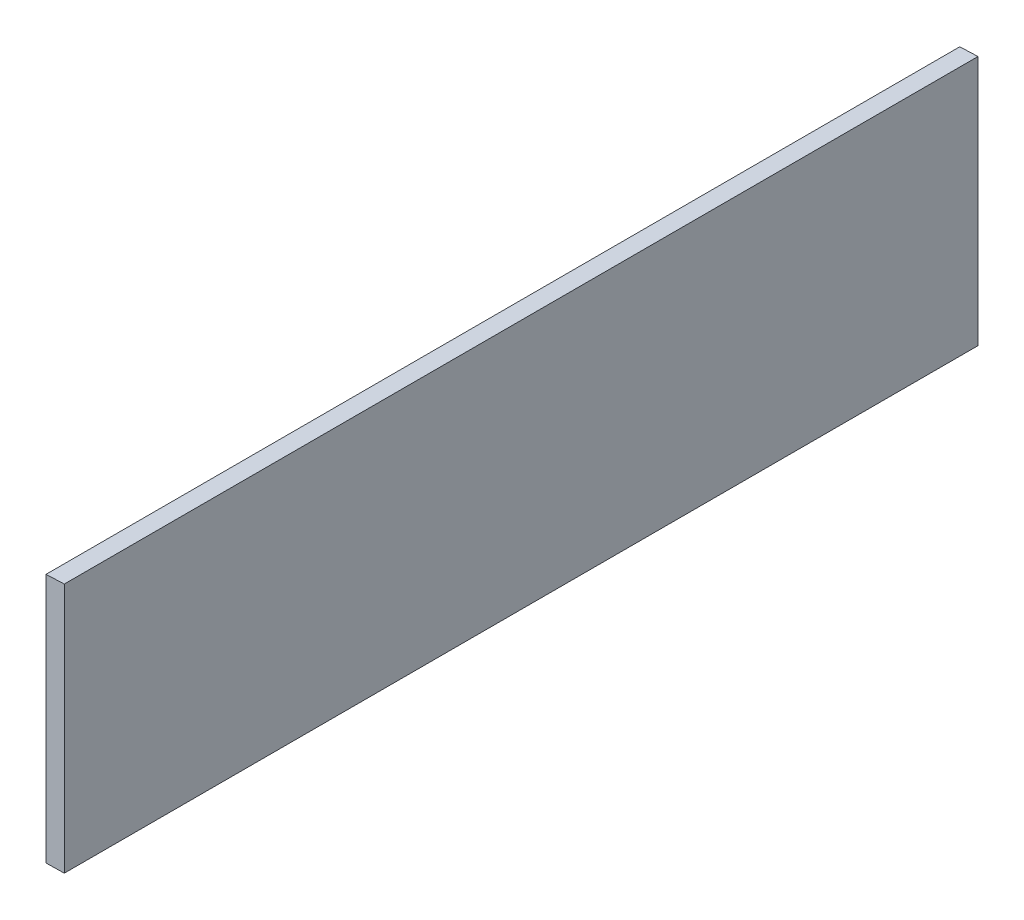
ISO-10303-21;
HEADER;
FILE_DESCRIPTION(('STEP AP214'),'2;1');
FILE_NAME('part.step','',(''),(''),'','','');
FILE_SCHEMA(('AUTOMOTIVE_DESIGN { 1 0 10303 214 1 1 1 1 }'));
ENDSEC;
DATA;
#1=APPLICATION_CONTEXT('core data for automotive mechanical design processes');
#2=APPLICATION_PROTOCOL_DEFINITION('international standard','automotive_design',2000,#1);
#3=PRODUCT_CONTEXT('',#1,'mechanical');
#4=PRODUCT('Part','Part','',(#3));
#5=PRODUCT_RELATED_PRODUCT_CATEGORY('part','',(#4));
#6=PRODUCT_DEFINITION_FORMATION('','',#4);
#7=PRODUCT_DEFINITION_CONTEXT('part definition',#1,'design');
#8=PRODUCT_DEFINITION('design','',#6,#7);
#9=PRODUCT_DEFINITION_SHAPE('','',#8);
#10=(LENGTH_UNIT() NAMED_UNIT(*) SI_UNIT(.MILLI.,.METRE.));
#11=(NAMED_UNIT(*) PLANE_ANGLE_UNIT() SI_UNIT($,.RADIAN.));
#12=(NAMED_UNIT(*) SI_UNIT($,.STERADIAN.) SOLID_ANGLE_UNIT());
#13=UNCERTAINTY_MEASURE_WITH_UNIT(LENGTH_MEASURE(1.E-05),#10,'distance_accuracy_value','');
#14=(GEOMETRIC_REPRESENTATION_CONTEXT(3) GLOBAL_UNCERTAINTY_ASSIGNED_CONTEXT((#13)) GLOBAL_UNIT_ASSIGNED_CONTEXT((#10,
#11,#12)) REPRESENTATION_CONTEXT('',''));
#15=CARTESIAN_POINT('',(0.,0.,0.));
#16=DIRECTION('',(0.,0.,1.));
#17=DIRECTION('',(1.,0.,0.));
#18=AXIS2_PLACEMENT_3D('',#15,#16,#17);
#19=CARTESIAN_POINT('',(78.232,0.,101.6));
#20=DIRECTION('',(1.,0.,0.));
#21=DIRECTION('',(0.,0.,-1.));
#22=AXIS2_PLACEMENT_3D('',#19,#20,#21);
#23=PLANE('',#22);
#24=DIRECTION('',(0.,-1.,0.));
#25=VECTOR('',#24,1.);
#26=CARTESIAN_POINT('',(78.232,0.,0.));
#27=LINE('',#26,#25);
#28=CARTESIAN_POINT('',(78.232,20.9057937484348,0.));
#29=VERTEX_POINT('',#28);
#30=CARTESIAN_POINT('',(78.232,-6.94151566862169,0.));
#31=VERTEX_POINT('',#30);
#32=EDGE_CURVE('E111',#29,#31,#27,.T.);
#33=ORIENTED_EDGE('',*,*,#32,.F.);
#34=DIRECTION('',(0.,0.,-1.));
#35=VECTOR('',#34,1.);
#36=CARTESIAN_POINT('',(78.232,20.9057937484348,101.6));
#37=LINE('',#36,#35);
#38=CARTESIAN_POINT('',(78.232,20.9057937484348,101.6));
#39=VERTEX_POINT('',#38);
#40=EDGE_CURVE('E11',#39,#29,#37,.T.);
#41=ORIENTED_EDGE('',*,*,#40,.F.);
#42=DIRECTION('',(0.,-1.,0.));
#43=VECTOR('',#42,1.);
#44=CARTESIAN_POINT('',(78.232,0.,101.6));
#45=LINE('',#44,#43);
#46=CARTESIAN_POINT('',(78.232,-6.94151566862169,101.6));
#47=VERTEX_POINT('',#46);
#48=EDGE_CURVE('E97',#39,#47,#45,.T.);
#49=ORIENTED_EDGE('',*,*,#48,.T.);
#50=DIRECTION('',(0.,0.,-1.));
#51=VECTOR('',#50,1.);
#52=CARTESIAN_POINT('',(78.232,-6.94151566862169,101.6));
#53=LINE('',#52,#51);
#54=EDGE_CURVE('E86',#47,#31,#53,.T.);
#55=ORIENTED_EDGE('',*,*,#54,.T.);
#56=EDGE_LOOP('',(#33,#41,#49,#55));
#57=FACE_BOUND('',#56,.T.);
#58=ADVANCED_FACE('F47',(#57),#23,.T.);
#59=CARTESIAN_POINT('',(304.8,0.,101.6));
#60=CARTESIAN_POINT('',(304.801618834867,0.0105404782342497,101.6));
#61=CARTESIAN_POINT('',(302.668974732205,0.220720306657686,101.6));
#62=CARTESIAN_POINT('',(300.521978172348,0.544561192924455,101.6));
#63=CARTESIAN_POINT('',(295.368886494755,1.2875328814366,101.6));
#64=CARTESIAN_POINT('',(289.160913878016,2.33645198943612,101.6));
#65=CARTESIAN_POINT('',(281.213840868588,3.71952821524651,101.6));
#66=CARTESIAN_POINT('',(272.021147758702,5.34248875191025,101.6));
#67=CARTESIAN_POINT('',(261.61106980903,7.12581444026362,101.6));
#68=CARTESIAN_POINT('',(250.148168886435,8.97226886192319,101.6));
#69=CARTESIAN_POINT('',(237.729227104966,10.7955186206566,101.6));
#70=CARTESIAN_POINT('',(224.4666688294,12.5459449601576,101.6));
#71=CARTESIAN_POINT('',(210.486966245019,14.2121187859213,101.6));
#72=CARTESIAN_POINT('',(195.939334379785,15.7786391055407,101.6));
#73=CARTESIAN_POINT('',(180.985449003124,17.2134697935107,101.6));
#74=CARTESIAN_POINT('',(165.790506747141,18.4813404806245,101.6));
#75=CARTESIAN_POINT('',(150.517335733816,19.5549981658971,101.6));
#76=CARTESIAN_POINT('',(135.325856865066,20.3976314342068,101.6));
#77=CARTESIAN_POINT('',(120.373654992444,20.983402039553,101.6));
#78=CARTESIAN_POINT('',(105.811891909707,21.2901601969632,101.6));
#79=CARTESIAN_POINT('',(91.7834874256825,21.2891036129287,101.6));
#80=CARTESIAN_POINT('',(78.4213620958899,20.9724951941915,101.6));
#81=CARTESIAN_POINT('',(65.8465275942558,20.3288254222291,101.6));
#82=CARTESIAN_POINT('',(54.1674017080585,19.3418794529403,101.6));
#83=CARTESIAN_POINT('',(43.474395079397,18.0330161813823,101.6));
#84=CARTESIAN_POINT('',(33.848689518524,16.4081639477774,101.6));
#85=CARTESIAN_POINT('',(25.3525506097424,14.4995409589336,101.6));
#86=CARTESIAN_POINT('',(18.0396313851052,12.3489155419126,101.6));
#87=CARTESIAN_POINT('',(11.9313896383541,10.0040370443031,101.6));
#88=CARTESIAN_POINT('',(7.08806507391777,7.53974305233434,101.6));
#89=CARTESIAN_POINT('',(3.40966941680189,5.06299945206396,101.6));
#90=CARTESIAN_POINT('',(1.15047901155272,2.68947505766282,101.6));
#91=CARTESIAN_POINT('',(-0.341456030932099,0.406213919537651,101.6));
#92=CARTESIAN_POINT('',(0.675206570607262,-2.00354445611635,101.6));
#93=CARTESIAN_POINT('',(3.58588645216127,-3.09345358903431,101.6));
#94=CARTESIAN_POINT('',(7.58846446919399,-4.35432891948392,101.6));
#95=CARTESIAN_POINT('',(13.2868004017993,-5.2878446315287,101.6));
#96=CARTESIAN_POINT('',(20.4322213072078,-6.08390726300857,101.6));
#97=CARTESIAN_POINT('',(29.0601683745068,-6.63974445543199,101.6));
#98=CARTESIAN_POINT('',(39.0679392576195,-6.99535450967022,101.6));
#99=CARTESIAN_POINT('',(50.3738441198648,-7.15527669006167,101.6));
#100=CARTESIAN_POINT('',(62.8572545491746,-7.14769616357257,101.6));
#101=CARTESIAN_POINT('',(76.3838964062546,-6.99316288317003,101.6));
#102=CARTESIAN_POINT('',(90.803190635399,-6.69861797165631,101.6));
#103=CARTESIAN_POINT('',(105.956834514056,-6.28368257572137,101.6));
#104=CARTESIAN_POINT('',(121.677348300616,-5.77052452309991,101.6));
#105=CARTESIAN_POINT('',(137.789976771838,-5.17586180163704,101.6));
#106=CARTESIAN_POINT('',(154.114864341391,-4.5177658027107,101.6));
#107=CARTESIAN_POINT('',(170.470018260583,-3.81546046006647,101.6));
#108=CARTESIAN_POINT('',(186.670857634618,-3.10033802920193,101.6));
#109=CARTESIAN_POINT('',(202.53208503216,-2.39092903583911,101.6));
#110=CARTESIAN_POINT('',(217.868391943782,-1.72482697070617,101.6));
#111=CARTESIAN_POINT('',(232.49282342498,-1.11499096294753,101.6));
#112=CARTESIAN_POINT('',(246.220887098932,-0.613930048939535,101.6));
#113=CARTESIAN_POINT('',(258.861467046827,-0.21565642278579,101.6));
#114=CARTESIAN_POINT('',(270.253080456814,0.0553538764319012,101.6));
#115=CARTESIAN_POINT('',(280.188997103178,0.219595784232055,101.6));
#116=CARTESIAN_POINT('',(288.650498905082,0.274785104169071,101.6));
#117=CARTESIAN_POINT('',(295.155593423962,0.261686700063953,101.6));
#118=CARTESIAN_POINT('',(300.464576396964,0.143666173546565,101.6));
#119=CARTESIAN_POINT('',(302.659622580391,0.115723261363336,101.6));
#120=CARTESIAN_POINT('',(304.798389635185,-0.010485328450841,101.6));
#121=CARTESIAN_POINT('',(304.8,0.,101.6));
#122=B_SPLINE_CURVE_WITH_KNOTS('',3,(#59,#60,#61,#62,#63,#64,#65,#66,#67,#68,#69,#70,#71,#72,
#73,#74,#75,#76,#77,#78,#79,#80,#81,#82,#83,#84,#85,#86,#87,#88,#89,#90,#91,#92,#93,#94,#95,#96,
#97,#98,#99,#100,#101,#102,#103,#104,#105,#106,#107,#108,#109,#110,#111,#112,#113,#114,#115,
#116,#117,#118,#119,#120,#121),.UNSPECIFIED.,.T.,.F.,(4,1,1,1,1,1,1,1,1,1,1,1,1,1,1,1,1,1,1,1,1,
1,1,1,1,1,1,1,1,1,1,1,1,1,1,1,1,1,1,1,1,1,1,1,1,1,1,1,1,1,1,1,1,1,1,1,1,1,1,1,4),(0.,
0.00163269975936438,0.00645583458730916,0.0142733719650962,0.0248437929891213,
0.0378823655436665,0.0531077412083435,0.0702622662658386,0.0891122502270111,0.109473671361897,
0.13118279114636,0.154044071471589,0.177807645474636,0.202201781747178,0.22695975540666,
0.25181615217405,0.276516239060432,0.300807474077759,0.324444283219669,0.347208207468047,
0.368893732879896,0.38931364936161,0.408315169114752,0.425773142382184,0.441588353173764,
0.455679939739565,0.468012176237163,0.47856661795016,0.487362799824908,0.494418821257916,
0.499795181040829,0.503597783370769,0.506520218572362,0.511061336465782,0.517923774571212,
0.527204743484056,0.538873845676215,0.552882495022793,0.569133331358659,0.587485764973588,
0.607759264884705,0.629725606442591,0.653145173637746,0.67776248750032,0.703306431792791,
0.729490768205414,0.756024037319581,0.782609438114174,0.80894956263962,0.834737242055006,
0.859674704050141,0.883459774321026,0.905784827252887,0.92634926584387,0.944857552516611,
0.961054710792989,0.97470052921618,0.985589471560421,0.993530514736504,0.998375842835772,1.),.UNSPECIFIED.);
#123=DIRECTION('',(0.,0.,-1.));
#124=VECTOR('',#123,1.);
#125=SURFACE_OF_LINEAR_EXTRUSION('',#122,#124);
#126=CARTESIAN_POINT('',(304.8,0.,0.));
#127=CARTESIAN_POINT('',(304.801618834867,0.0105404782342497,0.));
#128=CARTESIAN_POINT('',(302.668974732205,0.220720306657686,0.));
#129=CARTESIAN_POINT('',(300.521978172348,0.544561192924455,0.));
#130=CARTESIAN_POINT('',(295.368886494755,1.2875328814366,0.));
#131=CARTESIAN_POINT('',(289.160913878016,2.33645198943612,0.));
#132=CARTESIAN_POINT('',(281.213840868588,3.71952821524651,0.));
#133=CARTESIAN_POINT('',(272.021147758702,5.34248875191025,0.));
#134=CARTESIAN_POINT('',(261.61106980903,7.12581444026362,0.));
#135=CARTESIAN_POINT('',(250.148168886435,8.97226886192319,0.));
#136=CARTESIAN_POINT('',(237.729227104966,10.7955186206566,0.));
#137=CARTESIAN_POINT('',(224.4666688294,12.5459449601576,0.));
#138=CARTESIAN_POINT('',(210.486966245019,14.2121187859213,0.));
#139=CARTESIAN_POINT('',(195.939334379785,15.7786391055407,0.));
#140=CARTESIAN_POINT('',(180.985449003124,17.2134697935107,0.));
#141=CARTESIAN_POINT('',(165.790506747141,18.4813404806245,0.));
#142=CARTESIAN_POINT('',(150.517335733816,19.5549981658971,0.));
#143=CARTESIAN_POINT('',(135.325856865066,20.3976314342068,0.));
#144=CARTESIAN_POINT('',(120.373654992444,20.983402039553,0.));
#145=CARTESIAN_POINT('',(105.811891909707,21.2901601969632,0.));
#146=CARTESIAN_POINT('',(91.7834874256825,21.2891036129287,0.));
#147=CARTESIAN_POINT('',(78.4213620958899,20.9724951941915,0.));
#148=CARTESIAN_POINT('',(65.8465275942558,20.3288254222291,0.));
#149=CARTESIAN_POINT('',(54.1674017080585,19.3418794529403,0.));
#150=CARTESIAN_POINT('',(43.474395079397,18.0330161813823,0.));
#151=CARTESIAN_POINT('',(33.848689518524,16.4081639477774,0.));
#152=CARTESIAN_POINT('',(25.3525506097424,14.4995409589336,0.));
#153=CARTESIAN_POINT('',(18.0396313851052,12.3489155419126,0.));
#154=CARTESIAN_POINT('',(11.9313896383541,10.0040370443031,0.));
#155=CARTESIAN_POINT('',(7.08806507391777,7.53974305233434,0.));
#156=CARTESIAN_POINT('',(3.40966941680189,5.06299945206396,0.));
#157=CARTESIAN_POINT('',(1.15047901155272,2.68947505766282,0.));
#158=CARTESIAN_POINT('',(-0.341456030932099,0.406213919537651,0.));
#159=CARTESIAN_POINT('',(0.675206570607262,-2.00354445611635,0.));
#160=CARTESIAN_POINT('',(3.58588645216127,-3.09345358903431,0.));
#161=CARTESIAN_POINT('',(7.58846446919399,-4.35432891948392,0.));
#162=CARTESIAN_POINT('',(13.2868004017993,-5.2878446315287,0.));
#163=CARTESIAN_POINT('',(20.4322213072078,-6.08390726300857,0.));
#164=CARTESIAN_POINT('',(29.0601683745068,-6.63974445543199,0.));
#165=CARTESIAN_POINT('',(39.0679392576195,-6.99535450967022,0.));
#166=CARTESIAN_POINT('',(50.3738441198648,-7.15527669006167,0.));
#167=CARTESIAN_POINT('',(62.8572545491746,-7.14769616357257,0.));
#168=CARTESIAN_POINT('',(76.3838964062546,-6.99316288317003,0.));
#169=CARTESIAN_POINT('',(90.803190635399,-6.69861797165631,0.));
#170=CARTESIAN_POINT('',(105.956834514056,-6.28368257572137,0.));
#171=CARTESIAN_POINT('',(121.677348300616,-5.77052452309991,0.));
#172=CARTESIAN_POINT('',(137.789976771838,-5.17586180163704,0.));
#173=CARTESIAN_POINT('',(154.114864341391,-4.5177658027107,0.));
#174=CARTESIAN_POINT('',(170.470018260583,-3.81546046006647,0.));
#175=CARTESIAN_POINT('',(186.670857634618,-3.10033802920193,0.));
#176=CARTESIAN_POINT('',(202.53208503216,-2.39092903583911,0.));
#177=CARTESIAN_POINT('',(217.868391943782,-1.72482697070617,0.));
#178=CARTESIAN_POINT('',(232.49282342498,-1.11499096294753,0.));
#179=CARTESIAN_POINT('',(246.220887098932,-0.613930048939535,0.));
#180=CARTESIAN_POINT('',(258.861467046827,-0.21565642278579,0.));
#181=CARTESIAN_POINT('',(270.253080456814,0.0553538764319012,0.));
#182=CARTESIAN_POINT('',(280.188997103178,0.219595784232055,0.));
#183=CARTESIAN_POINT('',(288.650498905082,0.274785104169071,0.));
#184=CARTESIAN_POINT('',(295.155593423962,0.261686700063953,0.));
#185=CARTESIAN_POINT('',(300.464576396964,0.143666173546565,0.));
#186=CARTESIAN_POINT('',(302.659622580391,0.115723261363336,0.));
#187=CARTESIAN_POINT('',(304.798389635185,-0.010485328450841,0.));
#188=CARTESIAN_POINT('',(304.8,0.,0.));
#189=B_SPLINE_CURVE_WITH_KNOTS('',3,(#126,#127,#128,#129,#130,#131,#132,#133,#134,#135,#136,
#137,#138,#139,#140,#141,#142,#143,#144,#145,#146,#147,#148,#149,#150,#151,#152,#153,#154,#155,
#156,#157,#158,#159,#160,#161,#162,#163,#164,#165,#166,#167,#168,#169,#170,#171,#172,#173,#174,
#175,#176,#177,#178,#179,#180,#181,#182,#183,#184,#185,#186,#187,#188),.UNSPECIFIED.,.T.,.F.,(4,
1,1,1,1,1,1,1,1,1,1,1,1,1,1,1,1,1,1,1,1,1,1,1,1,1,1,1,1,1,1,1,1,1,1,1,1,1,1,1,1,1,1,1,1,1,1,1,1,
1,1,1,1,1,1,1,1,1,1,1,4),(0.,0.00163269975936438,0.00645583458730916,0.0142733719650962,
0.0248437929891213,0.0378823655436665,0.0531077412083435,0.0702622662658386,0.0891122502270111,
0.109473671361897,0.13118279114636,0.154044071471589,0.177807645474636,0.202201781747178,
0.22695975540666,0.25181615217405,0.276516239060432,0.300807474077759,0.324444283219669,
0.347208207468047,0.368893732879896,0.38931364936161,0.408315169114752,0.425773142382184,
0.441588353173764,0.455679939739565,0.468012176237163,0.47856661795016,0.487362799824908,
0.494418821257916,0.499795181040829,0.503597783370769,0.506520218572362,0.511061336465782,
0.517923774571212,0.527204743484056,0.538873845676215,0.552882495022793,0.569133331358659,
0.587485764973588,0.607759264884705,0.629725606442591,0.653145173637746,0.67776248750032,
0.703306431792791,0.729490768205414,0.756024037319581,0.782609438114174,0.80894956263962,
0.834737242055006,0.859674704050141,0.883459774321026,0.905784827252887,0.92634926584387,
0.944857552516611,0.961054710792989,0.97470052921618,0.985589471560421,0.993530514736504,
0.998375842835772,1.),.UNSPECIFIED.);
#190=CARTESIAN_POINT('',(76.2,20.8247578525033,0.));
#191=VERTEX_POINT('',#190);
#192=EDGE_CURVE('E102',#29,#191,#189,.T.);
#193=ORIENTED_EDGE('',*,*,#192,.T.);
#194=DIRECTION('',(0.,0.,-1.));
#195=VECTOR('',#194,1.);
#196=CARTESIAN_POINT('',(76.2,20.8247578525033,101.6));
#197=LINE('',#196,#195);
#198=CARTESIAN_POINT('',(76.2,20.8247578525033,101.6));
#199=VERTEX_POINT('',#198);
#200=EDGE_CURVE('E55',#199,#191,#197,.T.);
#201=ORIENTED_EDGE('',*,*,#200,.F.);
#202=EDGE_CURVE('E92',#39,#199,#122,.T.);
#203=ORIENTED_EDGE('',*,*,#202,.F.);
#204=ORIENTED_EDGE('',*,*,#40,.T.);
#205=EDGE_LOOP('',(#193,#201,#203,#204));
#206=FACE_BOUND('',#205,.T.);
#207=ADVANCED_FACE('F100',(#206),#125,.F.);
#208=CARTESIAN_POINT('',(76.2,0.,101.6));
#209=DIRECTION('',(1.,0.,0.));
#210=DIRECTION('',(0.,0.,-1.));
#211=AXIS2_PLACEMENT_3D('',#208,#209,#210);
#212=PLANE('',#211);
#213=DIRECTION('',(0.,-1.,0.));
#214=VECTOR('',#213,1.);
#215=CARTESIAN_POINT('',(76.2,0.,0.));
#216=LINE('',#215,#214);
#217=CARTESIAN_POINT('',(76.2,-6.97503984705092,0.));
#218=VERTEX_POINT('',#217);
#219=EDGE_CURVE('E79',#191,#218,#216,.T.);
#220=ORIENTED_EDGE('',*,*,#219,.T.);
#221=DIRECTION('',(0.,0.,-1.));
#222=VECTOR('',#221,1.);
#223=CARTESIAN_POINT('',(76.2,-6.97503984705092,101.6));
#224=LINE('',#223,#222);
#225=CARTESIAN_POINT('',(76.2,-6.97503984705092,101.6));
#226=VERTEX_POINT('',#225);
#227=EDGE_CURVE('E103',#226,#218,#224,.T.);
#228=ORIENTED_EDGE('',*,*,#227,.F.);
#229=DIRECTION('',(0.,-1.,0.));
#230=VECTOR('',#229,1.);
#231=CARTESIAN_POINT('',(76.2,0.,101.6));
#232=LINE('',#231,#230);
#233=EDGE_CURVE('E96',#199,#226,#232,.T.);
#234=ORIENTED_EDGE('',*,*,#233,.F.);
#235=ORIENTED_EDGE('',*,*,#200,.T.);
#236=EDGE_LOOP('',(#220,#228,#234,#235));
#237=FACE_BOUND('',#236,.T.);
#238=ADVANCED_FACE('F104',(#237),#212,.F.);
#239=EDGE_CURVE('E117',#218,#31,#189,.T.);
#240=ORIENTED_EDGE('',*,*,#239,.T.);
#241=ORIENTED_EDGE('',*,*,#54,.F.);
#242=EDGE_CURVE('E63',#226,#47,#122,.T.);
#243=ORIENTED_EDGE('',*,*,#242,.F.);
#244=ORIENTED_EDGE('',*,*,#227,.T.);
#245=EDGE_LOOP('',(#240,#241,#243,#244));
#246=FACE_BOUND('',#245,.T.);
#247=ADVANCED_FACE('F125',(#246),#125,.F.);
#248=CARTESIAN_POINT('',(0.,0.,101.6));
#249=DIRECTION('',(0.,0.,1.));
#250=DIRECTION('',(1.,0.,0.));
#251=AXIS2_PLACEMENT_3D('',#248,#249,#250);
#252=PLANE('',#251);
#253=ORIENTED_EDGE('',*,*,#48,.F.);
#254=ORIENTED_EDGE('',*,*,#202,.T.);
#255=ORIENTED_EDGE('',*,*,#233,.T.);
#256=ORIENTED_EDGE('',*,*,#242,.T.);
#257=EDGE_LOOP('',(#253,#254,#255,#256));
#258=FACE_BOUND('',#257,.T.);
#259=ADVANCED_FACE('F94',(#258),#252,.T.);
#260=CARTESIAN_POINT('',(0.,0.,0.));
#261=DIRECTION('',(0.,0.,1.));
#262=DIRECTION('',(1.,0.,0.));
#263=AXIS2_PLACEMENT_3D('',#260,#261,#262);
#264=PLANE('',#263);
#265=ORIENTED_EDGE('',*,*,#32,.T.);
#266=ORIENTED_EDGE('',*,*,#239,.F.);
#267=ORIENTED_EDGE('',*,*,#219,.F.);
#268=ORIENTED_EDGE('',*,*,#192,.F.);
#269=EDGE_LOOP('',(#265,#266,#267,#268));
#270=FACE_BOUND('',#269,.T.);
#271=ADVANCED_FACE('F127',(#270),#264,.F.);
#272=CLOSED_SHELL('',(#58,#207,#238,#247,#259,#271));
#273=MANIFOLD_SOLID_BREP('B2',#272);
#274=ADVANCED_BREP_SHAPE_REPRESENTATION('',(#18,#273),#14);
#275=SHAPE_DEFINITION_REPRESENTATION(#9,#274);
ENDSEC;
END-ISO-10303-21;
